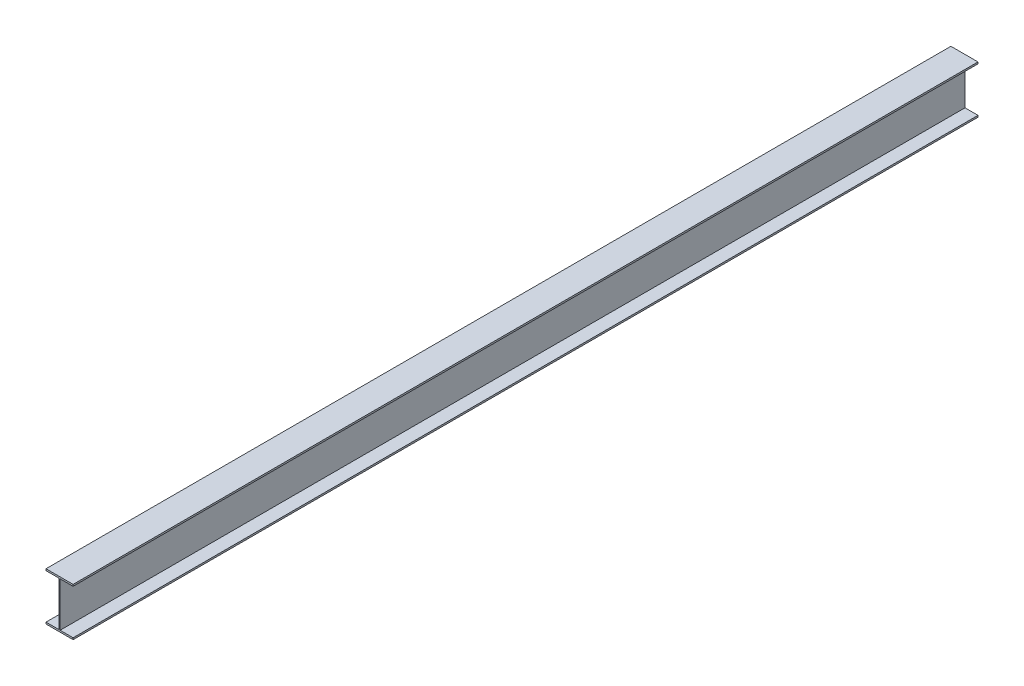
ISO-10303-21;
HEADER;
FILE_DESCRIPTION(('STEP AP214'),'2;1');
FILE_NAME('part.step','',(''),(''),'','','');
FILE_SCHEMA(('AUTOMOTIVE_DESIGN { 1 0 10303 214 1 1 1 1 }'));
ENDSEC;
DATA;
#1=APPLICATION_CONTEXT('core data for automotive mechanical design processes');
#2=APPLICATION_PROTOCOL_DEFINITION('international standard','automotive_design',2000,#1);
#3=PRODUCT_CONTEXT('',#1,'mechanical');
#4=PRODUCT('Part','Part','',(#3));
#5=PRODUCT_RELATED_PRODUCT_CATEGORY('part','',(#4));
#6=PRODUCT_DEFINITION_FORMATION('','',#4);
#7=PRODUCT_DEFINITION_CONTEXT('part definition',#1,'design');
#8=PRODUCT_DEFINITION('design','',#6,#7);
#9=PRODUCT_DEFINITION_SHAPE('','',#8);
#10=(LENGTH_UNIT() NAMED_UNIT(*) SI_UNIT(.MILLI.,.METRE.));
#11=(NAMED_UNIT(*) PLANE_ANGLE_UNIT() SI_UNIT($,.RADIAN.));
#12=(NAMED_UNIT(*) SI_UNIT($,.STERADIAN.) SOLID_ANGLE_UNIT());
#13=UNCERTAINTY_MEASURE_WITH_UNIT(LENGTH_MEASURE(1.E-05),#10,'distance_accuracy_value','');
#14=(GEOMETRIC_REPRESENTATION_CONTEXT(3) GLOBAL_UNCERTAINTY_ASSIGNED_CONTEXT((#13)) GLOBAL_UNIT_ASSIGNED_CONTEXT((#10,
#11,#12)) REPRESENTATION_CONTEXT('',''));
#15=CARTESIAN_POINT('',(0.,0.,0.));
#16=DIRECTION('',(0.,0.,1.));
#17=DIRECTION('',(1.,0.,0.));
#18=AXIS2_PLACEMENT_3D('',#15,#16,#17);
#19=CARTESIAN_POINT('',(0.,120.015,4876.8));
#20=DIRECTION('',(0.,-1.,0.));
#21=DIRECTION('',(1.,0.,0.));
#22=AXIS2_PLACEMENT_3D('',#19,#20,#21);
#23=PLANE('',#22);
#24=DIRECTION('',(-1.,0.,0.));
#25=VECTOR('',#24,1.);
#26=CARTESIAN_POINT('',(0.,120.015,0.));
#27=LINE('',#26,#25);
#28=CARTESIAN_POINT('',(73.025,120.015,0.));
#29=VERTEX_POINT('',#28);
#30=CARTESIAN_POINT('',(3.04799999999999,120.015,0.));
#31=VERTEX_POINT('',#30);
#32=EDGE_CURVE('E162',#29,#31,#27,.T.);
#33=ORIENTED_EDGE('',*,*,#32,.F.);
#34=DIRECTION('',(0.,0.,-1.));
#35=VECTOR('',#34,1.);
#36=CARTESIAN_POINT('',(73.025,120.015,4876.8));
#37=LINE('',#36,#35);
#38=CARTESIAN_POINT('',(73.025,120.015,4876.8));
#39=VERTEX_POINT('',#38);
#40=EDGE_CURVE('E11',#39,#29,#37,.T.);
#41=ORIENTED_EDGE('',*,*,#40,.F.);
#42=DIRECTION('',(-1.,0.,0.));
#43=VECTOR('',#42,1.);
#44=CARTESIAN_POINT('',(0.,120.015,4876.8));
#45=LINE('',#44,#43);
#46=CARTESIAN_POINT('',(3.04799999999999,120.015,4876.8));
#47=VERTEX_POINT('',#46);
#48=EDGE_CURVE('E191',#39,#47,#45,.T.);
#49=ORIENTED_EDGE('',*,*,#48,.T.);
#50=DIRECTION('',(0.,0.,-1.));
#51=VECTOR('',#50,1.);
#52=CARTESIAN_POINT('',(3.04799999999999,120.015,4876.8));
#53=LINE('',#52,#51);
#54=EDGE_CURVE('E59',#47,#31,#53,.T.);
#55=ORIENTED_EDGE('',*,*,#54,.T.);
#56=EDGE_LOOP('',(#33,#41,#49,#55));
#57=FACE_BOUND('',#56,.T.);
#58=ADVANCED_FACE('F43',(#57),#23,.T.);
#59=CARTESIAN_POINT('',(73.025,0.,4876.8));
#60=DIRECTION('',(-1.,0.,0.));
#61=DIRECTION('',(0.,0.,1.));
#62=AXIS2_PLACEMENT_3D('',#59,#60,#61);
#63=PLANE('',#62);
#64=DIRECTION('',(0.,1.,0.));
#65=VECTOR('',#64,1.);
#66=CARTESIAN_POINT('',(73.025,0.,0.));
#67=LINE('',#66,#65);
#68=CARTESIAN_POINT('',(73.025,129.159,0.));
#69=VERTEX_POINT('',#68);
#70=EDGE_CURVE('E164',#29,#69,#67,.T.);
#71=ORIENTED_EDGE('',*,*,#70,.T.);
#72=DIRECTION('',(0.,0.,-1.));
#73=VECTOR('',#72,1.);
#74=CARTESIAN_POINT('',(73.025,129.159,4876.8));
#75=LINE('',#74,#73);
#76=CARTESIAN_POINT('',(73.025,129.159,4876.8));
#77=VERTEX_POINT('',#76);
#78=EDGE_CURVE('E51',#77,#69,#75,.T.);
#79=ORIENTED_EDGE('',*,*,#78,.F.);
#80=DIRECTION('',(0.,1.,0.));
#81=VECTOR('',#80,1.);
#82=CARTESIAN_POINT('',(73.025,0.,4876.8));
#83=LINE('',#82,#81);
#84=EDGE_CURVE('E374',#39,#77,#83,.T.);
#85=ORIENTED_EDGE('',*,*,#84,.F.);
#86=ORIENTED_EDGE('',*,*,#40,.T.);
#87=EDGE_LOOP('',(#71,#79,#85,#86));
#88=FACE_BOUND('',#87,.T.);
#89=ADVANCED_FACE('F217',(#88),#63,.F.);
#90=CARTESIAN_POINT('',(0.,129.159,4876.8));
#91=DIRECTION('',(0.,1.,0.));
#92=DIRECTION('',(0.,0.,1.));
#93=AXIS2_PLACEMENT_3D('',#90,#91,#92);
#94=PLANE('',#93);
#95=DIRECTION('',(1.,0.,0.));
#96=VECTOR('',#95,1.);
#97=CARTESIAN_POINT('',(0.,129.159,0.));
#98=LINE('',#97,#96);
#99=CARTESIAN_POINT('',(-73.025,129.159,0.));
#100=VERTEX_POINT('',#99);
#101=EDGE_CURVE('E167',#100,#69,#98,.T.);
#102=ORIENTED_EDGE('',*,*,#101,.F.);
#103=DIRECTION('',(0.,0.,-1.));
#104=VECTOR('',#103,1.);
#105=CARTESIAN_POINT('',(-73.025,129.159,4876.8));
#106=LINE('',#105,#104);
#107=CARTESIAN_POINT('',(-73.025,129.159,4876.8));
#108=VERTEX_POINT('',#107);
#109=EDGE_CURVE('E207',#108,#100,#106,.T.);
#110=ORIENTED_EDGE('',*,*,#109,.F.);
#111=DIRECTION('',(1.,0.,0.));
#112=VECTOR('',#111,1.);
#113=CARTESIAN_POINT('',(0.,129.159,4876.8));
#114=LINE('',#113,#112);
#115=EDGE_CURVE('E214',#108,#77,#114,.T.);
#116=ORIENTED_EDGE('',*,*,#115,.T.);
#117=ORIENTED_EDGE('',*,*,#78,.T.);
#118=EDGE_LOOP('',(#102,#110,#116,#117));
#119=FACE_BOUND('',#118,.T.);
#120=ADVANCED_FACE('F212',(#119),#94,.T.);
#121=CARTESIAN_POINT('',(-73.025,0.,4876.8));
#122=DIRECTION('',(1.,0.,0.));
#123=DIRECTION('',(0.,0.,-1.));
#124=AXIS2_PLACEMENT_3D('',#121,#122,#123);
#125=PLANE('',#124);
#126=DIRECTION('',(0.,-1.,0.));
#127=VECTOR('',#126,1.);
#128=CARTESIAN_POINT('',(-73.025,0.,0.));
#129=LINE('',#128,#127);
#130=CARTESIAN_POINT('',(-73.025,120.015,0.));
#131=VERTEX_POINT('',#130);
#132=EDGE_CURVE('E170',#100,#131,#129,.T.);
#133=ORIENTED_EDGE('',*,*,#132,.T.);
#134=DIRECTION('',(0.,0.,-1.));
#135=VECTOR('',#134,1.);
#136=CARTESIAN_POINT('',(-73.025,120.015,4876.8));
#137=LINE('',#136,#135);
#138=CARTESIAN_POINT('',(-73.025,120.015,4876.8));
#139=VERTEX_POINT('',#138);
#140=EDGE_CURVE('E204',#139,#131,#137,.T.);
#141=ORIENTED_EDGE('',*,*,#140,.F.);
#142=DIRECTION('',(0.,-1.,0.));
#143=VECTOR('',#142,1.);
#144=CARTESIAN_POINT('',(-73.025,0.,4876.8));
#145=LINE('',#144,#143);
#146=EDGE_CURVE('E234',#108,#139,#145,.T.);
#147=ORIENTED_EDGE('',*,*,#146,.F.);
#148=ORIENTED_EDGE('',*,*,#109,.T.);
#149=EDGE_LOOP('',(#133,#141,#147,#148));
#150=FACE_BOUND('',#149,.T.);
#151=ADVANCED_FACE('F225',(#150),#125,.F.);
#152=CARTESIAN_POINT('',(0.,120.015,4876.8));
#153=DIRECTION('',(0.,1.,0.));
#154=DIRECTION('',(0.,0.,1.));
#155=AXIS2_PLACEMENT_3D('',#152,#153,#154);
#156=PLANE('',#155);
#157=DIRECTION('',(1.,0.,0.));
#158=VECTOR('',#157,1.);
#159=CARTESIAN_POINT('',(0.,120.015,0.));
#160=LINE('',#159,#158);
#161=CARTESIAN_POINT('',(-3.04800000000001,120.015,0.));
#162=VERTEX_POINT('',#161);
#163=EDGE_CURVE('E172',#131,#162,#160,.T.);
#164=ORIENTED_EDGE('',*,*,#163,.T.);
#165=DIRECTION('',(0.,0.,-1.));
#166=VECTOR('',#165,1.);
#167=CARTESIAN_POINT('',(-3.04800000000001,120.015,4876.8));
#168=LINE('',#167,#166);
#169=CARTESIAN_POINT('',(-3.04800000000001,120.015,4876.8));
#170=VERTEX_POINT('',#169);
#171=EDGE_CURVE('E201',#170,#162,#168,.T.);
#172=ORIENTED_EDGE('',*,*,#171,.F.);
#173=DIRECTION('',(1.,0.,0.));
#174=VECTOR('',#173,1.);
#175=CARTESIAN_POINT('',(0.,120.015,4876.8));
#176=LINE('',#175,#174);
#177=EDGE_CURVE('E231',#139,#170,#176,.T.);
#178=ORIENTED_EDGE('',*,*,#177,.F.);
#179=ORIENTED_EDGE('',*,*,#140,.T.);
#180=EDGE_LOOP('',(#164,#172,#178,#179));
#181=FACE_BOUND('',#180,.T.);
#182=ADVANCED_FACE('F229',(#181),#156,.F.);
#183=CARTESIAN_POINT('',(-3.04800000000001,0.,4876.8));
#184=DIRECTION('',(1.,0.,0.));
#185=DIRECTION('',(0.,0.,-1.));
#186=AXIS2_PLACEMENT_3D('',#183,#184,#185);
#187=PLANE('',#186);
#188=DIRECTION('',(0.,-1.,0.));
#189=VECTOR('',#188,1.);
#190=CARTESIAN_POINT('',(-3.04800000000001,0.,0.));
#191=LINE('',#190,#189);
#192=CARTESIAN_POINT('',(-3.04800000000001,-120.015,0.));
#193=VERTEX_POINT('',#192);
#194=EDGE_CURVE('E174',#162,#193,#191,.T.);
#195=ORIENTED_EDGE('',*,*,#194,.T.);
#196=DIRECTION('',(0.,0.,-1.));
#197=VECTOR('',#196,1.);
#198=CARTESIAN_POINT('',(-3.04800000000001,-120.015,4876.8));
#199=LINE('',#198,#197);
#200=CARTESIAN_POINT('',(-3.04800000000001,-120.015,4876.8));
#201=VERTEX_POINT('',#200);
#202=EDGE_CURVE('E199',#201,#193,#199,.T.);
#203=ORIENTED_EDGE('',*,*,#202,.F.);
#204=DIRECTION('',(0.,-1.,0.));
#205=VECTOR('',#204,1.);
#206=CARTESIAN_POINT('',(-3.04800000000001,0.,4876.8));
#207=LINE('',#206,#205);
#208=EDGE_CURVE('E233',#170,#201,#207,.T.);
#209=ORIENTED_EDGE('',*,*,#208,.F.);
#210=ORIENTED_EDGE('',*,*,#171,.T.);
#211=EDGE_LOOP('',(#195,#203,#209,#210));
#212=FACE_BOUND('',#211,.T.);
#213=ADVANCED_FACE('F321',(#212),#187,.F.);
#214=CARTESIAN_POINT('',(0.,-120.015,4876.8));
#215=DIRECTION('',(0.,1.,0.));
#216=DIRECTION('',(0.,0.,1.));
#217=AXIS2_PLACEMENT_3D('',#214,#215,#216);
#218=PLANE('',#217);
#219=DIRECTION('',(1.,0.,0.));
#220=VECTOR('',#219,1.);
#221=CARTESIAN_POINT('',(0.,-120.015,0.));
#222=LINE('',#221,#220);
#223=CARTESIAN_POINT('',(-73.025,-120.015,0.));
#224=VERTEX_POINT('',#223);
#225=EDGE_CURVE('E177',#224,#193,#222,.T.);
#226=ORIENTED_EDGE('',*,*,#225,.F.);
#227=DIRECTION('',(0.,0.,-1.));
#228=VECTOR('',#227,1.);
#229=CARTESIAN_POINT('',(-73.025,-120.015,4876.8));
#230=LINE('',#229,#228);
#231=CARTESIAN_POINT('',(-73.025,-120.015,4876.8));
#232=VERTEX_POINT('',#231);
#233=EDGE_CURVE('E197',#232,#224,#230,.T.);
#234=ORIENTED_EDGE('',*,*,#233,.F.);
#235=DIRECTION('',(1.,0.,0.));
#236=VECTOR('',#235,1.);
#237=CARTESIAN_POINT('',(0.,-120.015,4876.8));
#238=LINE('',#237,#236);
#239=EDGE_CURVE('E236',#232,#201,#238,.T.);
#240=ORIENTED_EDGE('',*,*,#239,.T.);
#241=ORIENTED_EDGE('',*,*,#202,.T.);
#242=EDGE_LOOP('',(#226,#234,#240,#241));
#243=FACE_BOUND('',#242,.T.);
#244=ADVANCED_FACE('F252',(#243),#218,.T.);
#245=CARTESIAN_POINT('',(-73.025,0.,4876.8));
#246=DIRECTION('',(-1.,0.,0.));
#247=DIRECTION('',(0.,0.,1.));
#248=AXIS2_PLACEMENT_3D('',#245,#246,#247);
#249=PLANE('',#248);
#250=DIRECTION('',(0.,1.,0.));
#251=VECTOR('',#250,1.);
#252=CARTESIAN_POINT('',(-73.025,0.,0.));
#253=LINE('',#252,#251);
#254=CARTESIAN_POINT('',(-73.025,-129.159,0.));
#255=VERTEX_POINT('',#254);
#256=EDGE_CURVE('E180',#255,#224,#253,.T.);
#257=ORIENTED_EDGE('',*,*,#256,.F.);
#258=DIRECTION('',(0.,0.,-1.));
#259=VECTOR('',#258,1.);
#260=CARTESIAN_POINT('',(-73.025,-129.159,4876.8));
#261=LINE('',#260,#259);
#262=CARTESIAN_POINT('',(-73.025,-129.159,4876.8));
#263=VERTEX_POINT('',#262);
#264=EDGE_CURVE('E195',#263,#255,#261,.T.);
#265=ORIENTED_EDGE('',*,*,#264,.F.);
#266=DIRECTION('',(0.,1.,0.));
#267=VECTOR('',#266,1.);
#268=CARTESIAN_POINT('',(-73.025,0.,4876.8));
#269=LINE('',#268,#267);
#270=EDGE_CURVE('E243',#263,#232,#269,.T.);
#271=ORIENTED_EDGE('',*,*,#270,.T.);
#272=ORIENTED_EDGE('',*,*,#233,.T.);
#273=EDGE_LOOP('',(#257,#265,#271,#272));
#274=FACE_BOUND('',#273,.T.);
#275=ADVANCED_FACE('F247',(#274),#249,.T.);
#276=CARTESIAN_POINT('',(0.,-129.159,4876.8));
#277=DIRECTION('',(0.,1.,0.));
#278=DIRECTION('',(0.,0.,1.));
#279=AXIS2_PLACEMENT_3D('',#276,#277,#278);
#280=PLANE('',#279);
#281=DIRECTION('',(1.,0.,0.));
#282=VECTOR('',#281,1.);
#283=CARTESIAN_POINT('',(0.,-129.159,0.));
#284=LINE('',#283,#282);
#285=CARTESIAN_POINT('',(73.025,-129.159,0.));
#286=VERTEX_POINT('',#285);
#287=EDGE_CURVE('E183',#255,#286,#284,.T.);
#288=ORIENTED_EDGE('',*,*,#287,.T.);
#289=DIRECTION('',(0.,0.,-1.));
#290=VECTOR('',#289,1.);
#291=CARTESIAN_POINT('',(73.025,-129.159,4876.8));
#292=LINE('',#291,#290);
#293=CARTESIAN_POINT('',(73.025,-129.159,4876.8));
#294=VERTEX_POINT('',#293);
#295=EDGE_CURVE('E154',#294,#286,#292,.T.);
#296=ORIENTED_EDGE('',*,*,#295,.F.);
#297=DIRECTION('',(1.,0.,0.));
#298=VECTOR('',#297,1.);
#299=CARTESIAN_POINT('',(0.,-129.159,4876.8));
#300=LINE('',#299,#298);
#301=EDGE_CURVE('E142',#263,#294,#300,.T.);
#302=ORIENTED_EDGE('',*,*,#301,.F.);
#303=ORIENTED_EDGE('',*,*,#264,.T.);
#304=EDGE_LOOP('',(#288,#296,#302,#303));
#305=FACE_BOUND('',#304,.T.);
#306=ADVANCED_FACE('F255',(#305),#280,.F.);
#307=CARTESIAN_POINT('',(73.025,0.,4876.8));
#308=DIRECTION('',(-1.,0.,0.));
#309=DIRECTION('',(0.,0.,1.));
#310=AXIS2_PLACEMENT_3D('',#307,#308,#309);
#311=PLANE('',#310);
#312=DIRECTION('',(0.,1.,0.));
#313=VECTOR('',#312,1.);
#314=CARTESIAN_POINT('',(73.025,0.,0.));
#315=LINE('',#314,#313);
#316=CARTESIAN_POINT('',(73.025,-120.015,0.));
#317=VERTEX_POINT('',#316);
#318=EDGE_CURVE('E151',#286,#317,#315,.T.);
#319=ORIENTED_EDGE('',*,*,#318,.T.);
#320=DIRECTION('',(0.,0.,-1.));
#321=VECTOR('',#320,1.);
#322=CARTESIAN_POINT('',(73.025,-120.015,4876.8));
#323=LINE('',#322,#321);
#324=CARTESIAN_POINT('',(73.025,-120.015,4876.8));
#325=VERTEX_POINT('',#324);
#326=EDGE_CURVE('E148',#325,#317,#323,.T.);
#327=ORIENTED_EDGE('',*,*,#326,.F.);
#328=DIRECTION('',(0.,1.,0.));
#329=VECTOR('',#328,1.);
#330=CARTESIAN_POINT('',(73.025,0.,4876.8));
#331=LINE('',#330,#329);
#332=EDGE_CURVE('E133',#294,#325,#331,.T.);
#333=ORIENTED_EDGE('',*,*,#332,.F.);
#334=ORIENTED_EDGE('',*,*,#295,.T.);
#335=EDGE_LOOP('',(#319,#327,#333,#334));
#336=FACE_BOUND('',#335,.T.);
#337=ADVANCED_FACE('F149',(#336),#311,.F.);
#338=CARTESIAN_POINT('',(0.,-120.015,4876.8));
#339=DIRECTION('',(0.,-1.,0.));
#340=DIRECTION('',(1.,0.,0.));
#341=AXIS2_PLACEMENT_3D('',#338,#339,#340);
#342=PLANE('',#341);
#343=DIRECTION('',(-1.,0.,0.));
#344=VECTOR('',#343,1.);
#345=CARTESIAN_POINT('',(0.,-120.015,0.));
#346=LINE('',#345,#344);
#347=CARTESIAN_POINT('',(3.04799999999999,-120.015,0.));
#348=VERTEX_POINT('',#347);
#349=EDGE_CURVE('E186',#317,#348,#346,.T.);
#350=ORIENTED_EDGE('',*,*,#349,.T.);
#351=DIRECTION('',(0.,0.,-1.));
#352=VECTOR('',#351,1.);
#353=CARTESIAN_POINT('',(3.04799999999999,-120.015,4876.8));
#354=LINE('',#353,#352);
#355=CARTESIAN_POINT('',(3.04799999999999,-120.015,4876.8));
#356=VERTEX_POINT('',#355);
#357=EDGE_CURVE('E97',#356,#348,#354,.T.);
#358=ORIENTED_EDGE('',*,*,#357,.F.);
#359=DIRECTION('',(-1.,0.,0.));
#360=VECTOR('',#359,1.);
#361=CARTESIAN_POINT('',(0.,-120.015,4876.8));
#362=LINE('',#361,#360);
#363=EDGE_CURVE('E139',#325,#356,#362,.T.);
#364=ORIENTED_EDGE('',*,*,#363,.F.);
#365=ORIENTED_EDGE('',*,*,#326,.T.);
#366=EDGE_LOOP('',(#350,#358,#364,#365));
#367=FACE_BOUND('',#366,.T.);
#368=ADVANCED_FACE('F156',(#367),#342,.F.);
#369=CARTESIAN_POINT('',(3.04799999999999,0.,4876.8));
#370=DIRECTION('',(1.,0.,0.));
#371=DIRECTION('',(0.,0.,-1.));
#372=AXIS2_PLACEMENT_3D('',#369,#370,#371);
#373=PLANE('',#372);
#374=DIRECTION('',(0.,-1.,0.));
#375=VECTOR('',#374,1.);
#376=CARTESIAN_POINT('',(3.04799999999999,0.,0.));
#377=LINE('',#376,#375);
#378=EDGE_CURVE('E188',#31,#348,#377,.T.);
#379=ORIENTED_EDGE('',*,*,#378,.F.);
#380=ORIENTED_EDGE('',*,*,#54,.F.);
#381=DIRECTION('',(0.,-1.,0.));
#382=VECTOR('',#381,1.);
#383=CARTESIAN_POINT('',(3.04799999999999,0.,4876.8));
#384=LINE('',#383,#382);
#385=EDGE_CURVE('E157',#47,#356,#384,.T.);
#386=ORIENTED_EDGE('',*,*,#385,.T.);
#387=ORIENTED_EDGE('',*,*,#357,.T.);
#388=EDGE_LOOP('',(#379,#380,#386,#387));
#389=FACE_BOUND('',#388,.T.);
#390=ADVANCED_FACE('F268',(#389),#373,.T.);
#391=CARTESIAN_POINT('',(0.,0.,4876.8));
#392=DIRECTION('',(0.,0.,1.));
#393=DIRECTION('',(1.,0.,0.));
#394=AXIS2_PLACEMENT_3D('',#391,#392,#393);
#395=PLANE('',#394);
#396=ORIENTED_EDGE('',*,*,#48,.F.);
#397=ORIENTED_EDGE('',*,*,#84,.T.);
#398=ORIENTED_EDGE('',*,*,#115,.F.);
#399=ORIENTED_EDGE('',*,*,#146,.T.);
#400=ORIENTED_EDGE('',*,*,#177,.T.);
#401=ORIENTED_EDGE('',*,*,#208,.T.);
#402=ORIENTED_EDGE('',*,*,#239,.F.);
#403=ORIENTED_EDGE('',*,*,#270,.F.);
#404=ORIENTED_EDGE('',*,*,#301,.T.);
#405=ORIENTED_EDGE('',*,*,#332,.T.);
#406=ORIENTED_EDGE('',*,*,#363,.T.);
#407=ORIENTED_EDGE('',*,*,#385,.F.);
#408=EDGE_LOOP('',(#396,#397,#398,#399,#400,#401,#402,#403,#404,#405,#406,#407));
#409=FACE_BOUND('',#408,.T.);
#410=ADVANCED_FACE('F136',(#409),#395,.T.);
#411=CARTESIAN_POINT('',(0.,0.,0.));
#412=DIRECTION('',(0.,0.,1.));
#413=DIRECTION('',(1.,0.,0.));
#414=AXIS2_PLACEMENT_3D('',#411,#412,#413);
#415=PLANE('',#414);
#416=ORIENTED_EDGE('',*,*,#32,.T.);
#417=ORIENTED_EDGE('',*,*,#378,.T.);
#418=ORIENTED_EDGE('',*,*,#349,.F.);
#419=ORIENTED_EDGE('',*,*,#318,.F.);
#420=ORIENTED_EDGE('',*,*,#287,.F.);
#421=ORIENTED_EDGE('',*,*,#256,.T.);
#422=ORIENTED_EDGE('',*,*,#225,.T.);
#423=ORIENTED_EDGE('',*,*,#194,.F.);
#424=ORIENTED_EDGE('',*,*,#163,.F.);
#425=ORIENTED_EDGE('',*,*,#132,.F.);
#426=ORIENTED_EDGE('',*,*,#101,.T.);
#427=ORIENTED_EDGE('',*,*,#70,.F.);
#428=EDGE_LOOP('',(#416,#417,#418,#419,#420,#421,#422,#423,#424,#425,#426,#427));
#429=FACE_BOUND('',#428,.T.);
#430=ADVANCED_FACE('F220',(#429),#415,.F.);
#431=CLOSED_SHELL('',(#58,#89,#120,#151,#182,#213,#244,#275,#306,#337,#368,#390,#410,#430));
#432=MANIFOLD_SOLID_BREP('B2',#431);
#433=ADVANCED_BREP_SHAPE_REPRESENTATION('',(#18,#432),#14);
#434=SHAPE_DEFINITION_REPRESENTATION(#9,#433);
ENDSEC;
END-ISO-10303-21;
